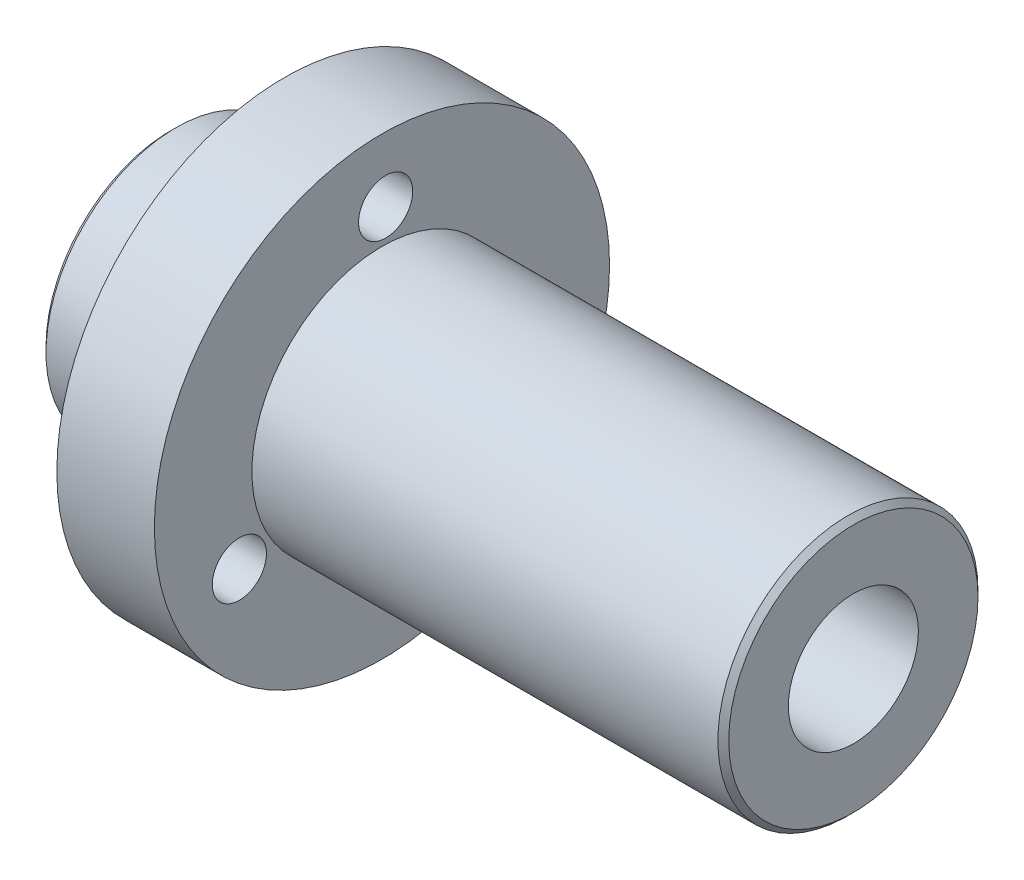
ISO-10303-21;
HEADER;
FILE_DESCRIPTION(('STEP AP214'),'2;1');
FILE_NAME('part.step','',(''),(''),'','','');
FILE_SCHEMA(('AUTOMOTIVE_DESIGN { 1 0 10303 214 1 1 1 1 }'));
ENDSEC;
DATA;
#1=APPLICATION_CONTEXT('core data for automotive mechanical design processes');
#2=APPLICATION_PROTOCOL_DEFINITION('international standard','automotive_design',2000,#1);
#3=PRODUCT_CONTEXT('',#1,'mechanical');
#4=PRODUCT('Part','Part','',(#3));
#5=PRODUCT_RELATED_PRODUCT_CATEGORY('part','',(#4));
#6=PRODUCT_DEFINITION_FORMATION('','',#4);
#7=PRODUCT_DEFINITION_CONTEXT('part definition',#1,'design');
#8=PRODUCT_DEFINITION('design','',#6,#7);
#9=PRODUCT_DEFINITION_SHAPE('','',#8);
#10=(LENGTH_UNIT() NAMED_UNIT(*) SI_UNIT(.MILLI.,.METRE.));
#11=(NAMED_UNIT(*) PLANE_ANGLE_UNIT() SI_UNIT($,.RADIAN.));
#12=(NAMED_UNIT(*) SI_UNIT($,.STERADIAN.) SOLID_ANGLE_UNIT());
#13=UNCERTAINTY_MEASURE_WITH_UNIT(LENGTH_MEASURE(1.E-05),#10,'distance_accuracy_value','');
#14=(GEOMETRIC_REPRESENTATION_CONTEXT(3) GLOBAL_UNCERTAINTY_ASSIGNED_CONTEXT((#13)) GLOBAL_UNIT_ASSIGNED_CONTEXT((#10,
#11,#12)) REPRESENTATION_CONTEXT('',''));
#15=CARTESIAN_POINT('',(0.,0.,0.));
#16=DIRECTION('',(0.,0.,1.));
#17=DIRECTION('',(1.,0.,0.));
#18=AXIS2_PLACEMENT_3D('',#15,#16,#17);
#19=CARTESIAN_POINT('',(39.,0.,0.));
#20=DIRECTION('',(1.,0.,0.));
#21=DIRECTION('',(0.,0.,-1.));
#22=AXIS2_PLACEMENT_3D('',#19,#20,#21);
#23=PLANE('',#22);
#24=CARTESIAN_POINT('',(39.,-14.4056368618,26.3149696296));
#25=DIRECTION('',(1.,0.,0.));
#26=DIRECTION('',(0.,0.,-1.));
#27=AXIS2_PLACEMENT_3D('',#24,#25,#26);
#28=CIRCLE('',#27,4.99999999999999);
#29=CARTESIAN_POINT('',(39.,-14.4056368618,21.3149696296));
#30=VERTEX_POINT('',#29);
#31=EDGE_CURVE('E80',#30,#30,#28,.T.);
#32=ORIENTED_EDGE('',*,*,#31,.F.);
#33=EDGE_LOOP('',(#32));
#34=FACE_BOUND('',#33,.T.);
#35=CARTESIAN_POINT('',(39.,29.9922506299,-0.681837334745));
#36=DIRECTION('',(1.,0.,0.));
#37=DIRECTION('',(0.,0.,-1.));
#38=AXIS2_PLACEMENT_3D('',#35,#36,#37);
#39=CIRCLE('',#38,4.99999999999999);
#40=CARTESIAN_POINT('',(39.,29.9922506299,-5.68183733474499));
#41=VERTEX_POINT('',#40);
#42=EDGE_CURVE('E74',#41,#41,#39,.T.);
#43=ORIENTED_EDGE('',*,*,#42,.F.);
#44=EDGE_LOOP('',(#43));
#45=FACE_BOUND('',#44,.T.);
#46=CARTESIAN_POINT('',(39.,-15.5866137681,-25.6331322948));
#47=DIRECTION('',(1.,0.,0.));
#48=DIRECTION('',(0.,0.,-1.));
#49=AXIS2_PLACEMENT_3D('',#46,#47,#48);
#50=CIRCLE('',#49,4.99999999999999);
#51=CARTESIAN_POINT('',(39.,-15.5866137681,-30.6331322948));
#52=VERTEX_POINT('',#51);
#53=EDGE_CURVE('E68',#52,#52,#50,.T.);
#54=ORIENTED_EDGE('',*,*,#53,.F.);
#55=EDGE_LOOP('',(#54));
#56=FACE_BOUND('',#55,.T.);
#57=CARTESIAN_POINT('',(39.,0.,0.));
#58=DIRECTION('',(1.,0.,0.));
#59=DIRECTION('',(0.,0.,-1.));
#60=AXIS2_PLACEMENT_3D('',#57,#58,#59);
#61=CIRCLE('',#60,42.);
#62=CARTESIAN_POINT('',(39.,0.,-42.));
#63=VERTEX_POINT('',#62);
#64=EDGE_CURVE('E56',#63,#63,#61,.T.);
#65=ORIENTED_EDGE('',*,*,#64,.T.);
#66=EDGE_LOOP('',(#65));
#67=FACE_BOUND('',#66,.T.);
#68=CARTESIAN_POINT('',(39.,0.,0.));
#69=DIRECTION('',(1.,0.,0.));
#70=DIRECTION('',(0.,0.,-1.));
#71=AXIS2_PLACEMENT_3D('',#68,#69,#70);
#72=CIRCLE('',#71,24.);
#73=CARTESIAN_POINT('',(39.,0.,-24.));
#74=VERTEX_POINT('',#73);
#75=EDGE_CURVE('E62',#74,#74,#72,.T.);
#76=ORIENTED_EDGE('',*,*,#75,.F.);
#77=EDGE_LOOP('',(#76));
#78=FACE_BOUND('',#77,.T.);
#79=ADVANCED_FACE('F33',(#34,#45,#56,#67,#78),#23,.T.);
#80=CARTESIAN_POINT('',(21.,42.,0.));
#81=DIRECTION('',(-1.,0.,0.));
#82=DIRECTION('',(0.,0.,1.));
#83=AXIS2_PLACEMENT_3D('',#80,#81,#82);
#84=PLANE('',#83);
#85=CARTESIAN_POINT('',(21.,-14.4056368618,26.3149696296));
#86=DIRECTION('',(-1.,0.,0.));
#87=DIRECTION('',(0.,0.,1.));
#88=AXIS2_PLACEMENT_3D('',#85,#86,#87);
#89=CIRCLE('',#88,4.99999999999999);
#90=CARTESIAN_POINT('',(21.,-14.4056368618,31.3149696296));
#91=VERTEX_POINT('',#90);
#92=EDGE_CURVE('E77',#91,#91,#89,.T.);
#93=ORIENTED_EDGE('',*,*,#92,.F.);
#94=EDGE_LOOP('',(#93));
#95=FACE_BOUND('',#94,.T.);
#96=CARTESIAN_POINT('',(21.,29.9922506299,-0.681837334745));
#97=DIRECTION('',(-1.,0.,0.));
#98=DIRECTION('',(0.,0.,1.));
#99=AXIS2_PLACEMENT_3D('',#96,#97,#98);
#100=CIRCLE('',#99,4.99999999999999);
#101=CARTESIAN_POINT('',(21.,29.9922506299,4.31816266525499));
#102=VERTEX_POINT('',#101);
#103=EDGE_CURVE('E71',#102,#102,#100,.T.);
#104=ORIENTED_EDGE('',*,*,#103,.F.);
#105=EDGE_LOOP('',(#104));
#106=FACE_BOUND('',#105,.T.);
#107=CARTESIAN_POINT('',(21.,-15.5866137681,-25.6331322948));
#108=DIRECTION('',(-1.,0.,0.));
#109=DIRECTION('',(0.,0.,1.));
#110=AXIS2_PLACEMENT_3D('',#107,#108,#109);
#111=CIRCLE('',#110,4.99999999999999);
#112=CARTESIAN_POINT('',(21.,-15.5866137681,-20.6331322948));
#113=VERTEX_POINT('',#112);
#114=EDGE_CURVE('E65',#113,#113,#111,.T.);
#115=ORIENTED_EDGE('',*,*,#114,.F.);
#116=EDGE_LOOP('',(#115));
#117=FACE_BOUND('',#116,.T.);
#118=CARTESIAN_POINT('',(21.,0.,0.));
#119=DIRECTION('',(1.,0.,0.));
#120=DIRECTION('',(0.,0.,-1.));
#121=AXIS2_PLACEMENT_3D('',#118,#119,#120);
#122=CIRCLE('',#121,42.);
#123=CARTESIAN_POINT('',(21.,0.,-42.));
#124=VERTEX_POINT('',#123);
#125=EDGE_CURVE('E53',#124,#124,#122,.T.);
#126=ORIENTED_EDGE('',*,*,#125,.F.);
#127=EDGE_LOOP('',(#126));
#128=FACE_BOUND('',#127,.T.);
#129=CARTESIAN_POINT('',(21.,0.,0.));
#130=DIRECTION('',(-1.,0.,0.));
#131=DIRECTION('',(0.,0.,1.));
#132=AXIS2_PLACEMENT_3D('',#129,#130,#131);
#133=CIRCLE('',#132,24.);
#134=CARTESIAN_POINT('',(21.,0.,-24.));
#135=VERTEX_POINT('',#134);
#136=EDGE_CURVE('E59',#135,#135,#133,.T.);
#137=ORIENTED_EDGE('',*,*,#136,.F.);
#138=EDGE_LOOP('',(#137));
#139=FACE_BOUND('',#138,.T.);
#140=ADVANCED_FACE('F112',(#95,#106,#117,#128,#139),#84,.T.);
#141=CARTESIAN_POINT('',(21.,0.,0.));
#142=DIRECTION('',(1.,0.,0.));
#143=DIRECTION('',(0.,0.,-1.));
#144=AXIS2_PLACEMENT_3D('',#141,#142,#143);
#145=CYLINDRICAL_SURFACE('',#144,42.);
#146=ORIENTED_EDGE('',*,*,#125,.T.);
#147=EDGE_LOOP('',(#146));
#148=FACE_BOUND('',#147,.T.);
#149=ORIENTED_EDGE('',*,*,#64,.F.);
#150=EDGE_LOOP('',(#149));
#151=FACE_BOUND('',#150,.T.);
#152=ADVANCED_FACE('F35',(#148,#151),#145,.T.);
#153=CARTESIAN_POINT('',(0.,0.,0.));
#154=DIRECTION('',(1.,0.,0.));
#155=DIRECTION('',(0.,0.,-1.));
#156=AXIS2_PLACEMENT_3D('',#153,#154,#155);
#157=CYLINDRICAL_SURFACE('',#156,24.);
#158=CARTESIAN_POINT('',(0.999999999999945,0.,0.));
#159=DIRECTION('',(-1.,0.,0.));
#160=DIRECTION('',(0.,0.,1.));
#161=AXIS2_PLACEMENT_3D('',#158,#159,#160);
#162=CIRCLE('',#161,24.);
#163=CARTESIAN_POINT('',(0.999999999999946,0.,-24.));
#164=VERTEX_POINT('',#163);
#165=EDGE_CURVE('E10',#164,#164,#162,.F.);
#166=CARTESIAN_POINT('',(0.999999999999946,0.,-24.));
#167=CARTESIAN_POINT('',(1.20833333333328,0.,-24.));
#168=CARTESIAN_POINT('',(1.41666666666661,0.,-24.));
#169=CARTESIAN_POINT('',(1.83333333333328,0.,-24.));
#170=CARTESIAN_POINT('',(2.04166666666662,0.,-24.));
#171=CARTESIAN_POINT('',(2.45833333333328,0.,-24.));
#172=CARTESIAN_POINT('',(2.66666666666662,0.,-24.));
#173=CARTESIAN_POINT('',(3.08333333333329,0.,-24.));
#174=CARTESIAN_POINT('',(3.29166666666662,0.,-24.));
#175=CARTESIAN_POINT('',(3.70833333333329,0.,-24.));
#176=CARTESIAN_POINT('',(3.91666666666662,0.,-24.));
#177=CARTESIAN_POINT('',(4.33333333333329,0.,-24.));
#178=CARTESIAN_POINT('',(4.54166666666662,0.,-24.));
#179=CARTESIAN_POINT('',(4.95833333333329,0.,-24.));
#180=CARTESIAN_POINT('',(5.16666666666663,0.,-24.));
#181=CARTESIAN_POINT('',(5.58333333333329,0.,-24.));
#182=CARTESIAN_POINT('',(5.79166666666663,0.,-24.));
#183=CARTESIAN_POINT('',(6.20833333333329,0.,-24.));
#184=CARTESIAN_POINT('',(6.41666666666663,0.,-24.));
#185=CARTESIAN_POINT('',(6.8333333333333,0.,-24.));
#186=CARTESIAN_POINT('',(7.04166666666663,0.,-24.));
#187=CARTESIAN_POINT('',(7.4583333333333,0.,-24.));
#188=CARTESIAN_POINT('',(7.66666666666663,0.,-24.));
#189=CARTESIAN_POINT('',(8.0833333333333,0.,-24.));
#190=CARTESIAN_POINT('',(8.29166666666663,0.,-24.));
#191=CARTESIAN_POINT('',(8.7083333333333,0.,-24.));
#192=CARTESIAN_POINT('',(8.91666666666664,0.,-24.));
#193=CARTESIAN_POINT('',(9.3333333333333,0.,-24.));
#194=CARTESIAN_POINT('',(9.54166666666664,0.,-24.));
#195=CARTESIAN_POINT('',(9.95833333333331,0.,-24.));
#196=CARTESIAN_POINT('',(10.1666666666666,0.,-24.));
#197=CARTESIAN_POINT('',(10.5833333333333,0.,-24.));
#198=CARTESIAN_POINT('',(10.7916666666666,0.,-24.));
#199=CARTESIAN_POINT('',(11.2083333333333,0.,-24.));
#200=CARTESIAN_POINT('',(11.4166666666666,0.,-24.));
#201=CARTESIAN_POINT('',(11.8333333333333,0.,-24.));
#202=CARTESIAN_POINT('',(12.0416666666666,0.,-24.));
#203=CARTESIAN_POINT('',(12.4583333333333,0.,-24.));
#204=CARTESIAN_POINT('',(12.6666666666666,0.,-24.));
#205=CARTESIAN_POINT('',(13.0833333333333,0.,-24.));
#206=CARTESIAN_POINT('',(13.2916666666666,0.,-24.));
#207=CARTESIAN_POINT('',(13.7083333333333,0.,-24.));
#208=CARTESIAN_POINT('',(13.9166666666667,0.,-24.));
#209=CARTESIAN_POINT('',(14.3333333333333,0.,-24.));
#210=CARTESIAN_POINT('',(14.5416666666667,0.,-24.));
#211=CARTESIAN_POINT('',(14.9583333333333,0.,-24.));
#212=CARTESIAN_POINT('',(15.1666666666667,0.,-24.));
#213=CARTESIAN_POINT('',(15.5833333333333,0.,-24.));
#214=CARTESIAN_POINT('',(15.7916666666667,0.,-24.));
#215=CARTESIAN_POINT('',(16.2083333333333,0.,-24.));
#216=CARTESIAN_POINT('',(16.4166666666667,0.,-24.));
#217=CARTESIAN_POINT('',(16.8333333333333,0.,-24.));
#218=CARTESIAN_POINT('',(17.0416666666667,0.,-24.));
#219=CARTESIAN_POINT('',(17.4583333333333,0.,-24.));
#220=CARTESIAN_POINT('',(17.6666666666667,0.,-24.));
#221=CARTESIAN_POINT('',(18.0833333333333,0.,-24.));
#222=CARTESIAN_POINT('',(18.2916666666667,0.,-24.));
#223=CARTESIAN_POINT('',(18.7083333333333,0.,-24.));
#224=CARTESIAN_POINT('',(18.9166666666667,0.,-24.));
#225=CARTESIAN_POINT('',(19.3333333333333,0.,-24.));
#226=CARTESIAN_POINT('',(19.5416666666667,0.,-24.));
#227=CARTESIAN_POINT('',(19.9583333333333,0.,-24.));
#228=CARTESIAN_POINT('',(20.1666666666667,0.,-24.));
#229=CARTESIAN_POINT('',(20.5833333333333,0.,-24.));
#230=CARTESIAN_POINT('',(20.7916666666667,0.,-24.));
#231=CARTESIAN_POINT('',(21.,0.,-24.));
#232=B_SPLINE_CURVE_WITH_KNOTS('',3,(#166,#167,#168,#169,#170,#171,#172,#173,#174,#175,#176,
#177,#178,#179,#180,#181,#182,#183,#184,#185,#186,#187,#188,#189,#190,#191,#192,#193,#194,#195,
#196,#197,#198,#199,#200,#201,#202,#203,#204,#205,#206,#207,#208,#209,#210,#211,#212,#213,#214,
#215,#216,#217,#218,#219,#220,#221,#222,#223,#224,#225,#226,#227,#228,#229,#230,#231),
.UNSPECIFIED.,.F.,.F.,(4,2,2,2,2,2,2,2,2,2,2,2,2,2,2,2,2,2,2,2,2,2,2,2,2,2,2,2,2,2,2,2,4),(0.,
0.625000000000002,1.25,1.87500000000001,2.50000000000001,3.12500000000001,3.75000000000001,
4.37500000000001,5.00000000000002,5.62500000000002,6.25000000000002,6.87500000000002,
7.50000000000002,8.12500000000002,8.75000000000002,9.37500000000003,10.,10.625,11.25,11.875,
12.5,13.125,13.75,14.375,15.,15.625,16.25,16.875,17.5,18.1250000000001,18.7500000000001,
19.3750000000001,20.0000000000001),.UNSPECIFIED.);
#233=EDGE_CURVE('BSEAM101',#164,#135,#232,.T.);
#234=ORIENTED_EDGE('',*,*,#165,.T.);
#235=ORIENTED_EDGE('',*,*,#136,.T.);
#236=ORIENTED_EDGE('',*,*,#233,.T.);
#237=ORIENTED_EDGE('',*,*,#233,.F.);
#238=EDGE_LOOP('',(#234,#236,#235,#237));
#239=FACE_BOUND('',#238,.T.);
#240=ADVANCED_FACE('F101',(#239),#157,.T.);
#241=CARTESIAN_POINT('',(0.,0.,0.));
#242=DIRECTION('',(-1.,0.,0.));
#243=DIRECTION('',(0.,0.,1.));
#244=AXIS2_PLACEMENT_3D('',#241,#242,#243);
#245=PLANE('',#244);
#246=CARTESIAN_POINT('',(0.,0.,0.));
#247=DIRECTION('',(-1.,0.,0.));
#248=DIRECTION('',(0.,0.,1.));
#249=AXIS2_PLACEMENT_3D('',#246,#247,#248);
#250=CIRCLE('',#249,23.0000000000001);
#251=CARTESIAN_POINT('',(0.,0.,23.0000000000001));
#252=VERTEX_POINT('',#251);
#253=EDGE_CURVE('E40',#252,#252,#250,.T.);
#254=ORIENTED_EDGE('',*,*,#253,.T.);
#255=EDGE_LOOP('',(#254));
#256=FACE_BOUND('',#255,.T.);
#257=CARTESIAN_POINT('',(0.,0.,0.));
#258=DIRECTION('',(-1.,0.,0.));
#259=DIRECTION('',(0.,0.,1.));
#260=AXIS2_PLACEMENT_3D('',#257,#258,#259);
#261=CIRCLE('',#260,18.);
#262=CARTESIAN_POINT('',(0.,0.,18.));
#263=VERTEX_POINT('',#262);
#264=EDGE_CURVE('E92',#263,#263,#261,.T.);
#265=ORIENTED_EDGE('',*,*,#264,.F.);
#266=EDGE_LOOP('',(#265));
#267=FACE_BOUND('',#266,.T.);
#268=ADVANCED_FACE('F98',(#256,#267),#245,.T.);
#269=CARTESIAN_POINT('',(126.,0.,0.));
#270=DIRECTION('',(-1.,0.,0.));
#271=DIRECTION('',(0.,0.,1.));
#272=AXIS2_PLACEMENT_3D('',#269,#270,#271);
#273=CYLINDRICAL_SURFACE('',#272,24.);
#274=CARTESIAN_POINT('',(125.,0.,0.));
#275=DIRECTION('',(1.,0.,0.));
#276=DIRECTION('',(0.,0.,-1.));
#277=AXIS2_PLACEMENT_3D('',#274,#275,#276);
#278=CIRCLE('',#277,24.);
#279=CARTESIAN_POINT('',(125.,0.,-24.));
#280=VERTEX_POINT('',#279);
#281=EDGE_CURVE('E44',#280,#280,#278,.F.);
#282=ORIENTED_EDGE('',*,*,#281,.T.);
#283=EDGE_LOOP('',(#282));
#284=FACE_BOUND('',#283,.T.);
#285=ORIENTED_EDGE('',*,*,#75,.T.);
#286=EDGE_LOOP('',(#285));
#287=FACE_BOUND('',#286,.T.);
#288=ADVANCED_FACE('F100',(#284,#287),#273,.T.);
#289=CARTESIAN_POINT('',(126.,0.,0.));
#290=DIRECTION('',(1.,0.,0.));
#291=DIRECTION('',(0.,0.,-1.));
#292=AXIS2_PLACEMENT_3D('',#289,#290,#291);
#293=PLANE('',#292);
#294=CARTESIAN_POINT('',(126.,0.,0.));
#295=DIRECTION('',(1.,0.,0.));
#296=DIRECTION('',(0.,0.,-1.));
#297=AXIS2_PLACEMENT_3D('',#294,#295,#296);
#298=CIRCLE('',#297,23.);
#299=CARTESIAN_POINT('',(126.,0.,-23.));
#300=VERTEX_POINT('',#299);
#301=EDGE_CURVE('E48',#300,#300,#298,.T.);
#302=ORIENTED_EDGE('',*,*,#301,.T.);
#303=EDGE_LOOP('',(#302));
#304=FACE_BOUND('',#303,.T.);
#305=CARTESIAN_POINT('',(126.,0.,0.));
#306=DIRECTION('',(1.,0.,0.));
#307=DIRECTION('',(0.,0.,-1.));
#308=AXIS2_PLACEMENT_3D('',#305,#306,#307);
#309=CIRCLE('',#308,12.);
#310=CARTESIAN_POINT('',(126.,0.,-12.));
#311=VERTEX_POINT('',#310);
#312=EDGE_CURVE('E83',#311,#311,#309,.T.);
#313=ORIENTED_EDGE('',*,*,#312,.F.);
#314=EDGE_LOOP('',(#313));
#315=FACE_BOUND('',#314,.T.);
#316=ADVANCED_FACE('F107',(#304,#315),#293,.T.);
#317=CARTESIAN_POINT('',(39.,-15.5866137681,-25.6331322948));
#318=DIRECTION('',(1.,0.,0.));
#319=DIRECTION('',(0.,0.,-1.));
#320=AXIS2_PLACEMENT_3D('',#317,#318,#319);
#321=CYLINDRICAL_SURFACE('',#320,4.99999999999999);
#322=ORIENTED_EDGE('',*,*,#53,.T.);
#323=EDGE_LOOP('',(#322));
#324=FACE_BOUND('',#323,.T.);
#325=ORIENTED_EDGE('',*,*,#114,.T.);
#326=EDGE_LOOP('',(#325));
#327=FACE_BOUND('',#326,.T.);
#328=ADVANCED_FACE('F172',(#324,#327),#321,.F.);
#329=CARTESIAN_POINT('',(39.,29.9922506299,-0.681837334745));
#330=DIRECTION('',(1.,0.,0.));
#331=DIRECTION('',(0.,0.,-1.));
#332=AXIS2_PLACEMENT_3D('',#329,#330,#331);
#333=CYLINDRICAL_SURFACE('',#332,4.99999999999999);
#334=ORIENTED_EDGE('',*,*,#42,.T.);
#335=EDGE_LOOP('',(#334));
#336=FACE_BOUND('',#335,.T.);
#337=ORIENTED_EDGE('',*,*,#103,.T.);
#338=EDGE_LOOP('',(#337));
#339=FACE_BOUND('',#338,.T.);
#340=ADVANCED_FACE('F214',(#336,#339),#333,.F.);
#341=CARTESIAN_POINT('',(39.,-14.4056368618,26.3149696296));
#342=DIRECTION('',(1.,0.,0.));
#343=DIRECTION('',(0.,0.,-1.));
#344=AXIS2_PLACEMENT_3D('',#341,#342,#343);
#345=CYLINDRICAL_SURFACE('',#344,4.99999999999999);
#346=ORIENTED_EDGE('',*,*,#31,.T.);
#347=EDGE_LOOP('',(#346));
#348=FACE_BOUND('',#347,.T.);
#349=ORIENTED_EDGE('',*,*,#92,.T.);
#350=EDGE_LOOP('',(#349));
#351=FACE_BOUND('',#350,.T.);
#352=ADVANCED_FACE('F210',(#348,#351),#345,.F.);
#353=CARTESIAN_POINT('',(0.,0.,0.));
#354=DIRECTION('',(-1.,0.,0.));
#355=DIRECTION('',(0.,0.,1.));
#356=AXIS2_PLACEMENT_3D('',#353,#354,#355);
#357=CYLINDRICAL_SURFACE('',#356,12.);
#358=CARTESIAN_POINT('',(99.,0.,0.));
#359=DIRECTION('',(-1.,0.,0.));
#360=DIRECTION('',(0.,0.,1.));
#361=AXIS2_PLACEMENT_3D('',#358,#359,#360);
#362=CIRCLE('',#361,12.);
#363=CARTESIAN_POINT('',(99.,0.,12.));
#364=VERTEX_POINT('',#363);
#365=EDGE_CURVE('E86',#364,#364,#362,.T.);
#366=ORIENTED_EDGE('',*,*,#365,.T.);
#367=EDGE_LOOP('',(#366));
#368=FACE_BOUND('',#367,.T.);
#369=ORIENTED_EDGE('',*,*,#312,.T.);
#370=EDGE_LOOP('',(#369));
#371=FACE_BOUND('',#370,.T.);
#372=ADVANCED_FACE('F206',(#368,#371),#357,.F.);
#373=CARTESIAN_POINT('',(99.,12.,0.));
#374=DIRECTION('',(1.,0.,0.));
#375=DIRECTION('',(0.,0.,-1.));
#376=AXIS2_PLACEMENT_3D('',#373,#374,#375);
#377=PLANE('',#376);
#378=ORIENTED_EDGE('',*,*,#365,.F.);
#379=EDGE_LOOP('',(#378));
#380=FACE_BOUND('',#379,.T.);
#381=CARTESIAN_POINT('',(99.,0.,0.));
#382=DIRECTION('',(-1.,0.,0.));
#383=DIRECTION('',(0.,0.,1.));
#384=AXIS2_PLACEMENT_3D('',#381,#382,#383);
#385=CIRCLE('',#384,18.);
#386=CARTESIAN_POINT('',(99.,0.,18.));
#387=VERTEX_POINT('',#386);
#388=EDGE_CURVE('E89',#387,#387,#385,.T.);
#389=ORIENTED_EDGE('',*,*,#388,.T.);
#390=EDGE_LOOP('',(#389));
#391=FACE_BOUND('',#390,.T.);
#392=ADVANCED_FACE('F202',(#380,#391),#377,.F.);
#393=CARTESIAN_POINT('',(0.,0.,0.));
#394=DIRECTION('',(-1.,0.,0.));
#395=DIRECTION('',(0.,0.,1.));
#396=AXIS2_PLACEMENT_3D('',#393,#394,#395);
#397=CYLINDRICAL_SURFACE('',#396,18.);
#398=ORIENTED_EDGE('',*,*,#388,.F.);
#399=EDGE_LOOP('',(#398));
#400=FACE_BOUND('',#399,.T.);
#401=ORIENTED_EDGE('',*,*,#264,.T.);
#402=EDGE_LOOP('',(#401));
#403=FACE_BOUND('',#402,.T.);
#404=ADVANCED_FACE('F96',(#400,#403),#397,.F.);
#405=CARTESIAN_POINT('',(126.,0.,0.));
#406=DIRECTION('',(-1.,0.,0.));
#407=DIRECTION('',(0.,0.,1.));
#408=AXIS2_PLACEMENT_3D('',#405,#406,#407);
#409=CONICAL_SURFACE('',#408,23.,0.785398163397447);
#410=ORIENTED_EDGE('',*,*,#281,.F.);
#411=EDGE_LOOP('',(#410));
#412=FACE_BOUND('',#411,.T.);
#413=ORIENTED_EDGE('',*,*,#301,.F.);
#414=EDGE_LOOP('',(#413));
#415=FACE_BOUND('',#414,.T.);
#416=ADVANCED_FACE('F180',(#412,#415),#409,.T.);
#417=CARTESIAN_POINT('',(0.,0.,0.));
#418=DIRECTION('',(1.,0.,0.));
#419=DIRECTION('',(0.,0.,-1.));
#420=AXIS2_PLACEMENT_3D('',#417,#418,#419);
#421=CONICAL_SURFACE('',#420,23.0000000000001,0.785398163397436);
#422=ORIENTED_EDGE('',*,*,#165,.F.);
#423=EDGE_LOOP('',(#422));
#424=FACE_BOUND('',#423,.T.);
#425=ORIENTED_EDGE('',*,*,#253,.F.);
#426=EDGE_LOOP('',(#425));
#427=FACE_BOUND('',#426,.T.);
#428=ADVANCED_FACE('F185',(#424,#427),#421,.T.);
#429=CLOSED_SHELL('',(#79,#140,#152,#240,#268,#288,#316,#328,#340,#352,#372,#392,#404,#416,#428));
#430=MANIFOLD_SOLID_BREP('B2',#429);
#431=ADVANCED_BREP_SHAPE_REPRESENTATION('',(#18,#430),#14);
#432=SHAPE_DEFINITION_REPRESENTATION(#9,#431);
ENDSEC;
END-ISO-10303-21;
